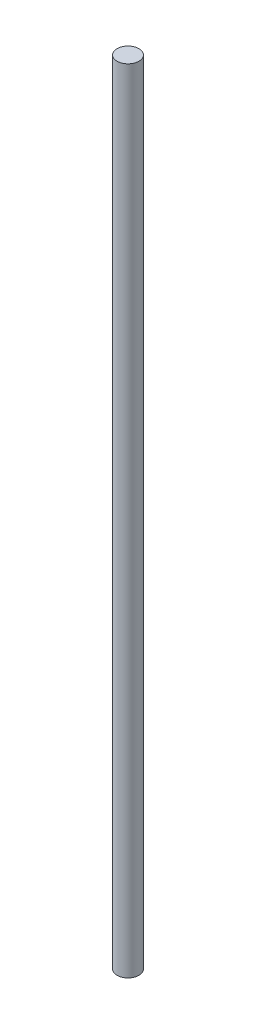
ISO-10303-21;
HEADER;
FILE_DESCRIPTION(('STEP AP214'),'2;1');
FILE_NAME('part.step','',(''),(''),'','','');
FILE_SCHEMA(('AUTOMOTIVE_DESIGN { 1 0 10303 214 1 1 1 1 }'));
ENDSEC;
DATA;
#1=APPLICATION_CONTEXT('core data for automotive mechanical design processes');
#2=APPLICATION_PROTOCOL_DEFINITION('international standard','automotive_design',2000,#1);
#3=PRODUCT_CONTEXT('',#1,'mechanical');
#4=PRODUCT('Part','Part','',(#3));
#5=PRODUCT_RELATED_PRODUCT_CATEGORY('part','',(#4));
#6=PRODUCT_DEFINITION_FORMATION('','',#4);
#7=PRODUCT_DEFINITION_CONTEXT('part definition',#1,'design');
#8=PRODUCT_DEFINITION('design','',#6,#7);
#9=PRODUCT_DEFINITION_SHAPE('','',#8);
#10=(LENGTH_UNIT() NAMED_UNIT(*) SI_UNIT(.MILLI.,.METRE.));
#11=(NAMED_UNIT(*) PLANE_ANGLE_UNIT() SI_UNIT($,.RADIAN.));
#12=(NAMED_UNIT(*) SI_UNIT($,.STERADIAN.) SOLID_ANGLE_UNIT());
#13=UNCERTAINTY_MEASURE_WITH_UNIT(LENGTH_MEASURE(1.E-05),#10,'distance_accuracy_value','');
#14=(GEOMETRIC_REPRESENTATION_CONTEXT(3) GLOBAL_UNCERTAINTY_ASSIGNED_CONTEXT((#13)) GLOBAL_UNIT_ASSIGNED_CONTEXT((#10,
#11,#12)) REPRESENTATION_CONTEXT('',''));
#15=CARTESIAN_POINT('',(0.,0.,0.));
#16=DIRECTION('',(0.,0.,1.));
#17=DIRECTION('',(1.,0.,0.));
#18=AXIS2_PLACEMENT_3D('',#15,#16,#17);
#19=CARTESIAN_POINT('',(0.,145.,0.));
#20=DIRECTION('',(0.,-1.,0.));
#21=DIRECTION('',(0.,0.,-1.));
#22=AXIS2_PLACEMENT_3D('',#19,#20,#21);
#23=CYLINDRICAL_SURFACE('',#22,2.);
#24=CARTESIAN_POINT('',(0.,145.,0.));
#25=DIRECTION('',(0.,1.,0.));
#26=DIRECTION('',(0.,0.,1.));
#27=AXIS2_PLACEMENT_3D('',#24,#25,#26);
#28=CIRCLE('',#27,2.);
#29=CARTESIAN_POINT('',(0.,145.,2.));
#30=VERTEX_POINT('',#29);
#31=EDGE_CURVE('E10',#30,#30,#28,.T.);
#32=ORIENTED_EDGE('',*,*,#31,.F.);
#33=EDGE_LOOP('',(#32));
#34=FACE_BOUND('',#33,.T.);
#35=CARTESIAN_POINT('',(0.,0.,0.));
#36=DIRECTION('',(0.,1.,0.));
#37=DIRECTION('',(0.,0.,1.));
#38=AXIS2_PLACEMENT_3D('',#35,#36,#37);
#39=CIRCLE('',#38,2.);
#40=CARTESIAN_POINT('',(0.,0.,2.));
#41=VERTEX_POINT('',#40);
#42=EDGE_CURVE('E40',#41,#41,#39,.T.);
#43=ORIENTED_EDGE('',*,*,#42,.T.);
#44=EDGE_LOOP('',(#43));
#45=FACE_BOUND('',#44,.T.);
#46=ADVANCED_FACE('F37',(#34,#45),#23,.T.);
#47=CARTESIAN_POINT('',(0.,145.,0.));
#48=DIRECTION('',(0.,1.,0.));
#49=DIRECTION('',(0.,0.,1.));
#50=AXIS2_PLACEMENT_3D('',#47,#48,#49);
#51=PLANE('',#50);
#52=ORIENTED_EDGE('',*,*,#31,.T.);
#53=EDGE_LOOP('',(#52));
#54=FACE_BOUND('',#53,.T.);
#55=ADVANCED_FACE('F54',(#54),#51,.T.);
#56=CARTESIAN_POINT('',(0.,0.,0.));
#57=DIRECTION('',(0.,1.,0.));
#58=DIRECTION('',(0.,0.,1.));
#59=AXIS2_PLACEMENT_3D('',#56,#57,#58);
#60=PLANE('',#59);
#61=ORIENTED_EDGE('',*,*,#42,.F.);
#62=EDGE_LOOP('',(#61));
#63=FACE_BOUND('',#62,.T.);
#64=ADVANCED_FACE('F52',(#63),#60,.F.);
#65=CLOSED_SHELL('',(#46,#55,#64));
#66=MANIFOLD_SOLID_BREP('B2',#65);
#67=ADVANCED_BREP_SHAPE_REPRESENTATION('',(#18,#66),#14);
#68=SHAPE_DEFINITION_REPRESENTATION(#9,#67);
ENDSEC;
END-ISO-10303-21;
